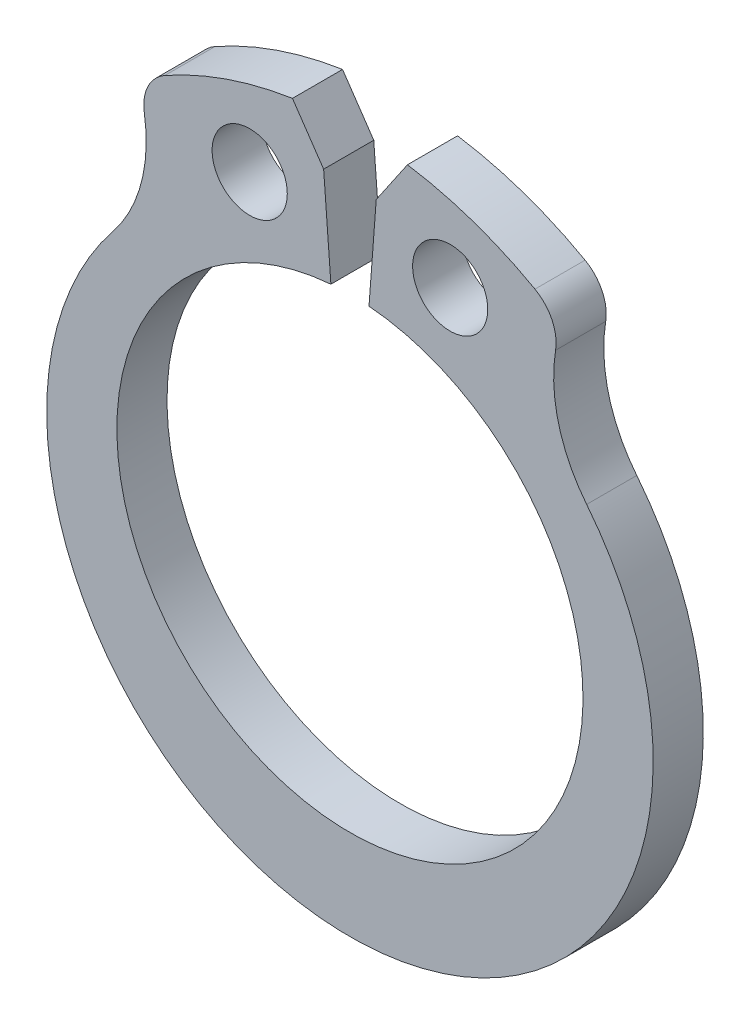
ISO-10303-21;
HEADER;
FILE_DESCRIPTION(('STEP AP214'),'2;1');
FILE_NAME('part.step','',(''),(''),'','','');
FILE_SCHEMA(('AUTOMOTIVE_DESIGN { 1 0 10303 214 1 1 1 1 }'));
ENDSEC;
DATA;
#1=APPLICATION_CONTEXT('core data for automotive mechanical design processes');
#2=APPLICATION_PROTOCOL_DEFINITION('international standard','automotive_design',2000,#1);
#3=PRODUCT_CONTEXT('',#1,'mechanical');
#4=PRODUCT('Part','Part','',(#3));
#5=PRODUCT_RELATED_PRODUCT_CATEGORY('part','',(#4));
#6=PRODUCT_DEFINITION_FORMATION('','',#4);
#7=PRODUCT_DEFINITION_CONTEXT('part definition',#1,'design');
#8=PRODUCT_DEFINITION('design','',#6,#7);
#9=PRODUCT_DEFINITION_SHAPE('','',#8);
#10=(LENGTH_UNIT() NAMED_UNIT(*) SI_UNIT(.MILLI.,.METRE.));
#11=(NAMED_UNIT(*) PLANE_ANGLE_UNIT() SI_UNIT($,.RADIAN.));
#12=(NAMED_UNIT(*) SI_UNIT($,.STERADIAN.) SOLID_ANGLE_UNIT());
#13=UNCERTAINTY_MEASURE_WITH_UNIT(LENGTH_MEASURE(1.E-05),#10,'distance_accuracy_value','');
#14=(GEOMETRIC_REPRESENTATION_CONTEXT(3) GLOBAL_UNCERTAINTY_ASSIGNED_CONTEXT((#13)) GLOBAL_UNIT_ASSIGNED_CONTEXT((#10,
#11,#12)) REPRESENTATION_CONTEXT('',''));
#15=CARTESIAN_POINT('',(0.,0.,0.));
#16=DIRECTION('',(0.,0.,1.));
#17=DIRECTION('',(1.,0.,0.));
#18=AXIS2_PLACEMENT_3D('',#15,#16,#17);
#19=CARTESIAN_POINT('',(2.38166766438672,0.368400837397194,1.));
#20=DIRECTION('',(0.,0.,1.));
#21=DIRECTION('',(1.,0.,0.));
#22=AXIS2_PLACEMENT_3D('',#19,#20,#21);
#23=PLANE('',#22);
#24=CARTESIAN_POINT('',(2.,5.76281181368957,1.));
#25=DIRECTION('',(0.,0.,-1.));
#26=DIRECTION('',(1.,0.,0.));
#27=AXIS2_PLACEMENT_3D('',#24,#25,#26);
#28=CIRCLE('',#27,0.75);
#29=CARTESIAN_POINT('',(1.25,5.76281181368957,1.));
#30=VERTEX_POINT('',#29);
#31=EDGE_CURVE('E46',#30,#30,#28,.T.);
#32=ORIENTED_EDGE('',*,*,#31,.T.);
#33=EDGE_LOOP('',(#32));
#34=FACE_BOUND('',#33,.T.);
#35=CARTESIAN_POINT('',(-2.,5.76281181368957,1.));
#36=DIRECTION('',(0.,0.,-1.));
#37=DIRECTION('',(-1.,0.,0.));
#38=AXIS2_PLACEMENT_3D('',#35,#36,#37);
#39=CIRCLE('',#38,0.75);
#40=CARTESIAN_POINT('',(-1.25,5.76281181368957,1.));
#41=VERTEX_POINT('',#40);
#42=EDGE_CURVE('E176',#41,#41,#39,.T.);
#43=ORIENTED_EDGE('',*,*,#42,.T.);
#44=EDGE_LOOP('',(#43));
#45=FACE_BOUND('',#44,.T.);
#46=CARTESIAN_POINT('',(0.,0.,1.));
#47=DIRECTION('',(0.,0.,-1.));
#48=DIRECTION('',(1.,0.,0.));
#49=AXIS2_PLACEMENT_3D('',#46,#47,#48);
#50=CIRCLE('',#49,4.65);
#51=CARTESIAN_POINT('',(0.38001478376536,4.63444589612607,1.));
#52=VERTEX_POINT('',#51);
#53=CARTESIAN_POINT('',(-0.38001478376536,4.63444589612607,1.));
#54=VERTEX_POINT('',#53);
#55=EDGE_CURVE('E142',#52,#54,#50,.T.);
#56=ORIENTED_EDGE('',*,*,#55,.T.);
#57=DIRECTION('',(-0.075268817204301,0.99716327908556,0.));
#58=VECTOR('',#57,1.);
#59=CARTESIAN_POINT('',(0.,-0.4,1.));
#60=LINE('',#59,#58);
#61=CARTESIAN_POINT('',(-0.524606441634727,6.55,1.));
#62=VERTEX_POINT('',#61);
#63=EDGE_CURVE('E126',#54,#62,#60,.T.);
#64=ORIENTED_EDGE('',*,*,#63,.T.);
#65=DIRECTION('',(-0.563766347354512,0.825934322806936,0.));
#66=VECTOR('',#65,1.);
#67=CARTESIAN_POINT('',(-0.524606441634727,6.55,1.));
#68=LINE('',#67,#66);
#69=CARTESIAN_POINT('',(-1.14733362509678,7.46231368629879,1.));
#70=VERTEX_POINT('',#69);
#71=EDGE_CURVE('E199',#62,#70,#68,.T.);
#72=ORIENTED_EDGE('',*,*,#71,.T.);
#73=CARTESIAN_POINT('',(0.,0.,1.));
#74=DIRECTION('',(0.,0.,-1.));
#75=DIRECTION('',(-1.,0.,0.));
#76=AXIS2_PLACEMENT_3D('',#73,#74,#75);
#77=CIRCLE('',#76,7.55);
#78=CARTESIAN_POINT('',(-3.69187189743232,6.58578635342428,1.));
#79=VERTEX_POINT('',#78);
#80=EDGE_CURVE('E197',#79,#70,#77,.T.);
#81=ORIENTED_EDGE('',*,*,#80,.F.);
#82=CARTESIAN_POINT('',(-3.28845543181885,5.8661474472554,1.));
#83=DIRECTION('',(0.,0.,-1.));
#84=DIRECTION('',(-1.,0.,0.));
#85=AXIS2_PLACEMENT_3D('',#82,#83,#84);
#86=CIRCLE('',#85,0.825);
#87=CARTESIAN_POINT('',(-4.10290526021445,5.73463137589376,1.));
#88=VERTEX_POINT('',#87);
#89=EDGE_CURVE('E196',#88,#79,#86,.T.);
#90=ORIENTED_EDGE('',*,*,#89,.F.);
#91=CARTESIAN_POINT('',(-7.06454099983476,5.2563911163969,1.));
#92=DIRECTION('',(0.,0.,-1.));
#93=DIRECTION('',(-1.,0.,0.));
#94=AXIS2_PLACEMENT_3D('',#91,#92,#93);
#95=CIRCLE('',#94,3.);
#96=CARTESIAN_POINT('',(-4.72270420430942,3.3813443374808,1.));
#97=VERTEX_POINT('',#96);
#98=EDGE_CURVE('E183',#88,#97,#95,.T.);
#99=ORIENTED_EDGE('',*,*,#98,.T.);
#100=CARTESIAN_POINT('',(0.,-0.4,1.));
#101=DIRECTION('',(0.,0.,-1.));
#102=DIRECTION('',(1.,0.,0.));
#103=AXIS2_PLACEMENT_3D('',#100,#101,#102);
#104=CIRCLE('',#103,6.05);
#105=CARTESIAN_POINT('',(4.72270420430942,3.3813443374808,1.));
#106=VERTEX_POINT('',#105);
#107=EDGE_CURVE('E11',#106,#97,#104,.T.);
#108=ORIENTED_EDGE('',*,*,#107,.F.);
#109=CARTESIAN_POINT('',(7.06454099983476,5.2563911163969,1.));
#110=DIRECTION('',(0.,0.,1.));
#111=DIRECTION('',(1.,0.,0.));
#112=AXIS2_PLACEMENT_3D('',#109,#110,#111);
#113=CIRCLE('',#112,3.);
#114=CARTESIAN_POINT('',(4.10290526021445,5.73463137589376,1.));
#115=VERTEX_POINT('',#114);
#116=EDGE_CURVE('E160',#115,#106,#113,.T.);
#117=ORIENTED_EDGE('',*,*,#116,.F.);
#118=CARTESIAN_POINT('',(3.28845543181885,5.8661474472554,1.));
#119=DIRECTION('',(0.,0.,-1.));
#120=DIRECTION('',(1.,0.,0.));
#121=AXIS2_PLACEMENT_3D('',#118,#119,#120);
#122=CIRCLE('',#121,0.825);
#123=CARTESIAN_POINT('',(3.69187189743232,6.58578635342428,1.));
#124=VERTEX_POINT('',#123);
#125=EDGE_CURVE('E155',#124,#115,#122,.T.);
#126=ORIENTED_EDGE('',*,*,#125,.F.);
#127=CARTESIAN_POINT('',(0.,0.,1.));
#128=DIRECTION('',(0.,0.,-1.));
#129=DIRECTION('',(1.,0.,0.));
#130=AXIS2_PLACEMENT_3D('',#127,#128,#129);
#131=CIRCLE('',#130,7.55);
#132=CARTESIAN_POINT('',(1.14733362509678,7.46231368629879,1.));
#133=VERTEX_POINT('',#132);
#134=EDGE_CURVE('E169',#133,#124,#131,.T.);
#135=ORIENTED_EDGE('',*,*,#134,.F.);
#136=DIRECTION('',(0.563766347354512,0.825934322806936,0.));
#137=VECTOR('',#136,1.);
#138=CARTESIAN_POINT('',(0.524606441634727,6.55,1.));
#139=LINE('',#138,#137);
#140=CARTESIAN_POINT('',(0.524606441634727,6.55,1.));
#141=VERTEX_POINT('',#140);
#142=EDGE_CURVE('E146',#141,#133,#139,.T.);
#143=ORIENTED_EDGE('',*,*,#142,.F.);
#144=DIRECTION('',(0.075268817204301,0.99716327908556,0.));
#145=VECTOR('',#144,1.);
#146=CARTESIAN_POINT('',(0.,-0.4,1.));
#147=LINE('',#146,#145);
#148=EDGE_CURVE('E148',#52,#141,#147,.T.);
#149=ORIENTED_EDGE('',*,*,#148,.F.);
#150=EDGE_LOOP('',(#56,#64,#72,#81,#90,#99,#108,#117,#126,#135,#143,#149));
#151=FACE_BOUND('',#150,.T.);
#152=ADVANCED_FACE('F17',(#34,#45,#151),#23,.T.);
#153=CARTESIAN_POINT('',(0.,-0.4,0.));
#154=DIRECTION('',(0.,0.,-1.));
#155=DIRECTION('',(1.,0.,0.));
#156=AXIS2_PLACEMENT_3D('',#153,#154,#155);
#157=CYLINDRICAL_SURFACE('',#156,6.05);
#158=ORIENTED_EDGE('',*,*,#107,.T.);
#159=DIRECTION('',(0.,0.,-1.));
#160=VECTOR('',#159,1.);
#161=CARTESIAN_POINT('',(-4.72270420430942,3.3813443374808,1.));
#162=LINE('',#161,#160);
#163=CARTESIAN_POINT('',(-4.72270420430942,3.3813443374808,0.));
#164=VERTEX_POINT('',#163);
#165=EDGE_CURVE('E185',#97,#164,#162,.T.);
#166=ORIENTED_EDGE('',*,*,#165,.T.);
#167=CARTESIAN_POINT('',(0.,-0.4,0.));
#168=DIRECTION('',(0.,0.,1.));
#169=DIRECTION('',(1.,0.,0.));
#170=AXIS2_PLACEMENT_3D('',#167,#168,#169);
#171=CIRCLE('',#170,6.05);
#172=CARTESIAN_POINT('',(4.72270420430942,3.3813443374808,0.));
#173=VERTEX_POINT('',#172);
#174=EDGE_CURVE('E21',#164,#173,#171,.T.);
#175=ORIENTED_EDGE('',*,*,#174,.T.);
#176=DIRECTION('',(0.,0.,1.));
#177=VECTOR('',#176,1.);
#178=CARTESIAN_POINT('',(4.72270420430942,3.3813443374808,0.));
#179=LINE('',#178,#177);
#180=EDGE_CURVE('E27',#173,#106,#179,.T.);
#181=ORIENTED_EDGE('',*,*,#180,.T.);
#182=EDGE_LOOP('',(#158,#166,#175,#181));
#183=FACE_BOUND('',#182,.T.);
#184=ADVANCED_FACE('F263',(#183),#157,.T.);
#185=CARTESIAN_POINT('',(7.06454099983476,5.2563911163969,0.));
#186=DIRECTION('',(0.,0.,-1.));
#187=DIRECTION('',(1.,0.,0.));
#188=AXIS2_PLACEMENT_3D('',#185,#186,#187);
#189=CYLINDRICAL_SURFACE('',#188,3.);
#190=ORIENTED_EDGE('',*,*,#116,.T.);
#191=ORIENTED_EDGE('',*,*,#180,.F.);
#192=CARTESIAN_POINT('',(7.06454099983476,5.2563911163969,0.));
#193=DIRECTION('',(0.,0.,1.));
#194=DIRECTION('',(1.,0.,0.));
#195=AXIS2_PLACEMENT_3D('',#192,#193,#194);
#196=CIRCLE('',#195,3.);
#197=CARTESIAN_POINT('',(4.10290526021445,5.73463137589376,0.));
#198=VERTEX_POINT('',#197);
#199=EDGE_CURVE('E226',#198,#173,#196,.T.);
#200=ORIENTED_EDGE('',*,*,#199,.F.);
#201=DIRECTION('',(0.,0.,1.));
#202=VECTOR('',#201,1.);
#203=CARTESIAN_POINT('',(4.10290526021445,5.73463137589376,0.));
#204=LINE('',#203,#202);
#205=EDGE_CURVE('E158',#198,#115,#204,.T.);
#206=ORIENTED_EDGE('',*,*,#205,.T.);
#207=EDGE_LOOP('',(#190,#191,#200,#206));
#208=FACE_BOUND('',#207,.T.);
#209=ADVANCED_FACE('F19',(#208),#189,.F.);
#210=CARTESIAN_POINT('',(3.28845543181885,5.8661474472554,0.));
#211=DIRECTION('',(0.,0.,-1.));
#212=DIRECTION('',(1.,0.,0.));
#213=AXIS2_PLACEMENT_3D('',#210,#211,#212);
#214=CYLINDRICAL_SURFACE('',#213,0.825);
#215=ORIENTED_EDGE('',*,*,#125,.T.);
#216=ORIENTED_EDGE('',*,*,#205,.F.);
#217=CARTESIAN_POINT('',(3.28845543181885,5.8661474472554,0.));
#218=DIRECTION('',(0.,0.,1.));
#219=DIRECTION('',(1.,0.,0.));
#220=AXIS2_PLACEMENT_3D('',#217,#218,#219);
#221=CIRCLE('',#220,0.825);
#222=CARTESIAN_POINT('',(3.69187189743232,6.58578635342428,0.));
#223=VERTEX_POINT('',#222);
#224=EDGE_CURVE('E208',#198,#223,#221,.T.);
#225=ORIENTED_EDGE('',*,*,#224,.T.);
#226=DIRECTION('',(0.,0.,1.));
#227=VECTOR('',#226,1.);
#228=CARTESIAN_POINT('',(3.69187189743232,6.58578635342428,0.));
#229=LINE('',#228,#227);
#230=EDGE_CURVE('E159',#223,#124,#229,.T.);
#231=ORIENTED_EDGE('',*,*,#230,.T.);
#232=EDGE_LOOP('',(#215,#216,#225,#231));
#233=FACE_BOUND('',#232,.T.);
#234=ADVANCED_FACE('F223',(#233),#214,.T.);
#235=CARTESIAN_POINT('',(0.,0.,0.));
#236=DIRECTION('',(0.,0.,-1.));
#237=DIRECTION('',(1.,0.,0.));
#238=AXIS2_PLACEMENT_3D('',#235,#236,#237);
#239=CYLINDRICAL_SURFACE('',#238,7.55);
#240=ORIENTED_EDGE('',*,*,#134,.T.);
#241=ORIENTED_EDGE('',*,*,#230,.F.);
#242=CARTESIAN_POINT('',(0.,0.,0.));
#243=DIRECTION('',(0.,0.,1.));
#244=DIRECTION('',(1.,0.,0.));
#245=AXIS2_PLACEMENT_3D('',#242,#243,#244);
#246=CIRCLE('',#245,7.55);
#247=CARTESIAN_POINT('',(1.14733362509678,7.46231368629879,0.));
#248=VERTEX_POINT('',#247);
#249=EDGE_CURVE('E151',#223,#248,#246,.T.);
#250=ORIENTED_EDGE('',*,*,#249,.T.);
#251=DIRECTION('',(0.,0.,1.));
#252=VECTOR('',#251,1.);
#253=CARTESIAN_POINT('',(1.14733362509678,7.46231368629879,0.));
#254=LINE('',#253,#252);
#255=EDGE_CURVE('E172',#248,#133,#254,.T.);
#256=ORIENTED_EDGE('',*,*,#255,.T.);
#257=EDGE_LOOP('',(#240,#241,#250,#256));
#258=FACE_BOUND('',#257,.T.);
#259=ADVANCED_FACE('F218',(#258),#239,.T.);
#260=CARTESIAN_POINT('',(0.835970033365753,7.0061568431494,0.));
#261=DIRECTION('',(-0.825934322806936,0.563766347354512,0.));
#262=DIRECTION('',(-0.563766347354512,-0.825934322806936,0.));
#263=AXIS2_PLACEMENT_3D('',#260,#261,#262);
#264=PLANE('',#263);
#265=ORIENTED_EDGE('',*,*,#142,.T.);
#266=ORIENTED_EDGE('',*,*,#255,.F.);
#267=DIRECTION('',(0.563766347354512,0.825934322806936,0.));
#268=VECTOR('',#267,1.);
#269=CARTESIAN_POINT('',(0.524606441634727,6.55,0.));
#270=LINE('',#269,#268);
#271=CARTESIAN_POINT('',(0.524606441634727,6.55,0.));
#272=VERTEX_POINT('',#271);
#273=EDGE_CURVE('E125',#272,#248,#270,.T.);
#274=ORIENTED_EDGE('',*,*,#273,.F.);
#275=DIRECTION('',(0.,0.,1.));
#276=VECTOR('',#275,1.);
#277=CARTESIAN_POINT('',(0.524606441634727,6.55,0.));
#278=LINE('',#277,#276);
#279=EDGE_CURVE('E121',#272,#141,#278,.T.);
#280=ORIENTED_EDGE('',*,*,#279,.T.);
#281=EDGE_LOOP('',(#265,#266,#274,#280));
#282=FACE_BOUND('',#281,.T.);
#283=ADVANCED_FACE('F216',(#282),#264,.T.);
#284=CARTESIAN_POINT('',(0.277399809065845,3.275,0.));
#285=DIRECTION('',(-0.99716327908556,0.075268817204301,0.));
#286=DIRECTION('',(-0.075268817204301,-0.99716327908556,0.));
#287=AXIS2_PLACEMENT_3D('',#284,#285,#286);
#288=PLANE('',#287);
#289=DIRECTION('',(0.,0.,1.));
#290=VECTOR('',#289,1.);
#291=CARTESIAN_POINT('',(0.38001478376536,4.63444589612607,0.5));
#292=LINE('',#291,#290);
#293=CARTESIAN_POINT('',(0.38001478376536,4.63444589612607,0.));
#294=VERTEX_POINT('',#293);
#295=EDGE_CURVE('E119',#294,#52,#292,.T.);
#296=ORIENTED_EDGE('',*,*,#295,.T.);
#297=ORIENTED_EDGE('',*,*,#148,.T.);
#298=ORIENTED_EDGE('',*,*,#279,.F.);
#299=DIRECTION('',(0.075268817204301,0.99716327908556,0.));
#300=VECTOR('',#299,1.);
#301=CARTESIAN_POINT('',(0.,-0.4,0.));
#302=LINE('',#301,#300);
#303=EDGE_CURVE('E114',#294,#272,#302,.T.);
#304=ORIENTED_EDGE('',*,*,#303,.F.);
#305=EDGE_LOOP('',(#296,#297,#298,#304));
#306=FACE_BOUND('',#305,.T.);
#307=ADVANCED_FACE('F116',(#306),#288,.T.);
#308=CARTESIAN_POINT('',(2.,5.76281181368957,0.5));
#309=DIRECTION('',(0.,0.,-1.));
#310=DIRECTION('',(1.,0.,0.));
#311=AXIS2_PLACEMENT_3D('',#308,#309,#310);
#312=CYLINDRICAL_SURFACE('',#311,0.75);
#313=ORIENTED_EDGE('',*,*,#31,.F.);
#314=EDGE_LOOP('',(#313));
#315=FACE_BOUND('',#314,.T.);
#316=CARTESIAN_POINT('',(2.,5.76281181368957,0.));
#317=DIRECTION('',(0.,0.,1.));
#318=DIRECTION('',(1.,0.,0.));
#319=AXIS2_PLACEMENT_3D('',#316,#317,#318);
#320=CIRCLE('',#319,0.75);
#321=CARTESIAN_POINT('',(1.25,5.76281181368957,0.));
#322=VERTEX_POINT('',#321);
#323=EDGE_CURVE('E163',#322,#322,#320,.T.);
#324=ORIENTED_EDGE('',*,*,#323,.F.);
#325=EDGE_LOOP('',(#324));
#326=FACE_BOUND('',#325,.T.);
#327=ADVANCED_FACE('F273',(#315,#326),#312,.F.);
#328=CARTESIAN_POINT('',(-7.06454099983476,5.2563911163969,1.));
#329=DIRECTION('',(0.,0.,1.));
#330=DIRECTION('',(-1.,0.,0.));
#331=AXIS2_PLACEMENT_3D('',#328,#329,#330);
#332=CYLINDRICAL_SURFACE('',#331,3.);
#333=CARTESIAN_POINT('',(-7.06454099983476,5.2563911163969,0.));
#334=DIRECTION('',(0.,0.,-1.));
#335=DIRECTION('',(-1.,0.,0.));
#336=AXIS2_PLACEMENT_3D('',#333,#334,#335);
#337=CIRCLE('',#336,3.);
#338=CARTESIAN_POINT('',(-4.10290526021445,5.73463137589376,0.));
#339=VERTEX_POINT('',#338);
#340=EDGE_CURVE('E182',#339,#164,#337,.T.);
#341=ORIENTED_EDGE('',*,*,#340,.T.);
#342=ORIENTED_EDGE('',*,*,#165,.F.);
#343=ORIENTED_EDGE('',*,*,#98,.F.);
#344=DIRECTION('',(0.,0.,-1.));
#345=VECTOR('',#344,1.);
#346=CARTESIAN_POINT('',(-4.10290526021445,5.73463137589376,1.));
#347=LINE('',#346,#345);
#348=EDGE_CURVE('E194',#88,#339,#347,.T.);
#349=ORIENTED_EDGE('',*,*,#348,.T.);
#350=EDGE_LOOP('',(#341,#342,#343,#349));
#351=FACE_BOUND('',#350,.T.);
#352=ADVANCED_FACE('F275',(#351),#332,.F.);
#353=CARTESIAN_POINT('',(-3.28845543181885,5.8661474472554,1.));
#354=DIRECTION('',(0.,0.,1.));
#355=DIRECTION('',(-1.,0.,0.));
#356=AXIS2_PLACEMENT_3D('',#353,#354,#355);
#357=CYLINDRICAL_SURFACE('',#356,0.825);
#358=CARTESIAN_POINT('',(-3.28845543181885,5.8661474472554,0.));
#359=DIRECTION('',(0.,0.,1.));
#360=DIRECTION('',(-1.,0.,0.));
#361=AXIS2_PLACEMENT_3D('',#358,#359,#360);
#362=CIRCLE('',#361,0.825);
#363=CARTESIAN_POINT('',(-3.69187189743232,6.58578635342428,0.));
#364=VERTEX_POINT('',#363);
#365=EDGE_CURVE('E178',#364,#339,#362,.T.);
#366=ORIENTED_EDGE('',*,*,#365,.T.);
#367=ORIENTED_EDGE('',*,*,#348,.F.);
#368=ORIENTED_EDGE('',*,*,#89,.T.);
#369=DIRECTION('',(0.,0.,-1.));
#370=VECTOR('',#369,1.);
#371=CARTESIAN_POINT('',(-3.69187189743232,6.58578635342428,1.));
#372=LINE('',#371,#370);
#373=EDGE_CURVE('E202',#79,#364,#372,.T.);
#374=ORIENTED_EDGE('',*,*,#373,.T.);
#375=EDGE_LOOP('',(#366,#367,#368,#374));
#376=FACE_BOUND('',#375,.T.);
#377=ADVANCED_FACE('F235',(#376),#357,.T.);
#378=CARTESIAN_POINT('',(0.,0.,1.));
#379=DIRECTION('',(0.,0.,1.));
#380=DIRECTION('',(-1.,0.,0.));
#381=AXIS2_PLACEMENT_3D('',#378,#379,#380);
#382=CYLINDRICAL_SURFACE('',#381,7.55);
#383=CARTESIAN_POINT('',(0.,0.,0.));
#384=DIRECTION('',(0.,0.,1.));
#385=DIRECTION('',(-1.,0.,0.));
#386=AXIS2_PLACEMENT_3D('',#383,#384,#385);
#387=CIRCLE('',#386,7.55);
#388=CARTESIAN_POINT('',(-1.14733362509678,7.46231368629879,0.));
#389=VERTEX_POINT('',#388);
#390=EDGE_CURVE('E181',#389,#364,#387,.T.);
#391=ORIENTED_EDGE('',*,*,#390,.T.);
#392=ORIENTED_EDGE('',*,*,#373,.F.);
#393=ORIENTED_EDGE('',*,*,#80,.T.);
#394=DIRECTION('',(0.,0.,-1.));
#395=VECTOR('',#394,1.);
#396=CARTESIAN_POINT('',(-1.14733362509678,7.46231368629879,1.));
#397=LINE('',#396,#395);
#398=EDGE_CURVE('E203',#70,#389,#397,.T.);
#399=ORIENTED_EDGE('',*,*,#398,.T.);
#400=EDGE_LOOP('',(#391,#392,#393,#399));
#401=FACE_BOUND('',#400,.T.);
#402=ADVANCED_FACE('F239',(#401),#382,.T.);
#403=CARTESIAN_POINT('',(-0.835970033365753,7.0061568431494,1.));
#404=DIRECTION('',(0.825934322806936,0.563766347354512,0.));
#405=DIRECTION('',(0.563766347354512,-0.825934322806936,0.));
#406=AXIS2_PLACEMENT_3D('',#403,#404,#405);
#407=PLANE('',#406);
#408=DIRECTION('',(-0.563766347354512,0.825934322806936,0.));
#409=VECTOR('',#408,1.);
#410=CARTESIAN_POINT('',(-0.524606441634727,6.55,0.));
#411=LINE('',#410,#409);
#412=CARTESIAN_POINT('',(-0.524606441634727,6.55,0.));
#413=VERTEX_POINT('',#412);
#414=EDGE_CURVE('E166',#413,#389,#411,.T.);
#415=ORIENTED_EDGE('',*,*,#414,.T.);
#416=ORIENTED_EDGE('',*,*,#398,.F.);
#417=ORIENTED_EDGE('',*,*,#71,.F.);
#418=DIRECTION('',(0.,0.,-1.));
#419=VECTOR('',#418,1.);
#420=CARTESIAN_POINT('',(-0.524606441634727,6.55,1.));
#421=LINE('',#420,#419);
#422=EDGE_CURVE('E154',#62,#413,#421,.T.);
#423=ORIENTED_EDGE('',*,*,#422,.T.);
#424=EDGE_LOOP('',(#415,#416,#417,#423));
#425=FACE_BOUND('',#424,.T.);
#426=ADVANCED_FACE('F249',(#425),#407,.T.);
#427=CARTESIAN_POINT('',(-2.,5.76281181368957,0.5));
#428=DIRECTION('',(0.,0.,1.));
#429=DIRECTION('',(-1.,0.,0.));
#430=AXIS2_PLACEMENT_3D('',#427,#428,#429);
#431=CYLINDRICAL_SURFACE('',#430,0.75);
#432=CARTESIAN_POINT('',(-2.,5.76281181368957,0.));
#433=DIRECTION('',(0.,0.,1.));
#434=DIRECTION('',(-1.,0.,0.));
#435=AXIS2_PLACEMENT_3D('',#432,#433,#434);
#436=CIRCLE('',#435,0.75);
#437=CARTESIAN_POINT('',(-1.25,5.76281181368957,0.));
#438=VERTEX_POINT('',#437);
#439=EDGE_CURVE('E165',#438,#438,#436,.T.);
#440=ORIENTED_EDGE('',*,*,#439,.F.);
#441=EDGE_LOOP('',(#440));
#442=FACE_BOUND('',#441,.T.);
#443=ORIENTED_EDGE('',*,*,#42,.F.);
#444=EDGE_LOOP('',(#443));
#445=FACE_BOUND('',#444,.T.);
#446=ADVANCED_FACE('F251',(#442,#445),#431,.F.);
#447=CARTESIAN_POINT('',(2.38166766438672,0.368400837397194,0.));
#448=DIRECTION('',(0.,0.,1.));
#449=DIRECTION('',(1.,0.,0.));
#450=AXIS2_PLACEMENT_3D('',#447,#448,#449);
#451=PLANE('',#450);
#452=ORIENTED_EDGE('',*,*,#439,.T.);
#453=EDGE_LOOP('',(#452));
#454=FACE_BOUND('',#453,.T.);
#455=ORIENTED_EDGE('',*,*,#323,.T.);
#456=EDGE_LOOP('',(#455));
#457=FACE_BOUND('',#456,.T.);
#458=CARTESIAN_POINT('',(0.,0.,0.));
#459=DIRECTION('',(0.,0.,1.));
#460=DIRECTION('',(1.,0.,0.));
#461=AXIS2_PLACEMENT_3D('',#458,#459,#460);
#462=CIRCLE('',#461,4.65);
#463=CARTESIAN_POINT('',(-0.38001478376536,4.63444589612607,0.));
#464=VERTEX_POINT('',#463);
#465=EDGE_CURVE('E129',#464,#294,#462,.T.);
#466=ORIENTED_EDGE('',*,*,#465,.T.);
#467=ORIENTED_EDGE('',*,*,#303,.T.);
#468=ORIENTED_EDGE('',*,*,#273,.T.);
#469=ORIENTED_EDGE('',*,*,#249,.F.);
#470=ORIENTED_EDGE('',*,*,#224,.F.);
#471=ORIENTED_EDGE('',*,*,#199,.T.);
#472=ORIENTED_EDGE('',*,*,#174,.F.);
#473=ORIENTED_EDGE('',*,*,#340,.F.);
#474=ORIENTED_EDGE('',*,*,#365,.F.);
#475=ORIENTED_EDGE('',*,*,#390,.F.);
#476=ORIENTED_EDGE('',*,*,#414,.F.);
#477=DIRECTION('',(-0.075268817204301,0.99716327908556,0.));
#478=VECTOR('',#477,1.);
#479=CARTESIAN_POINT('',(0.,-0.4,0.));
#480=LINE('',#479,#478);
#481=EDGE_CURVE('E133',#464,#413,#480,.T.);
#482=ORIENTED_EDGE('',*,*,#481,.F.);
#483=EDGE_LOOP('',(#466,#467,#468,#469,#470,#471,#472,#473,#474,#475,#476,#482));
#484=FACE_BOUND('',#483,.T.);
#485=ADVANCED_FACE('F130',(#454,#457,#484),#451,.F.);
#486=CARTESIAN_POINT('',(-0.277399809065845,3.275,1.));
#487=DIRECTION('',(0.99716327908556,0.075268817204301,0.));
#488=DIRECTION('',(0.075268817204301,-0.99716327908556,0.));
#489=AXIS2_PLACEMENT_3D('',#486,#487,#488);
#490=PLANE('',#489);
#491=DIRECTION('',(0.,0.,-1.));
#492=VECTOR('',#491,1.);
#493=CARTESIAN_POINT('',(-0.38001478376536,4.63444589612607,0.5));
#494=LINE('',#493,#492);
#495=EDGE_CURVE('E137',#54,#464,#494,.T.);
#496=ORIENTED_EDGE('',*,*,#495,.T.);
#497=ORIENTED_EDGE('',*,*,#481,.T.);
#498=ORIENTED_EDGE('',*,*,#422,.F.);
#499=ORIENTED_EDGE('',*,*,#63,.F.);
#500=EDGE_LOOP('',(#496,#497,#498,#499));
#501=FACE_BOUND('',#500,.T.);
#502=ADVANCED_FACE('F247',(#501),#490,.T.);
#503=CARTESIAN_POINT('',(0.,0.,0.5));
#504=DIRECTION('',(0.,0.,-1.));
#505=DIRECTION('',(1.,0.,0.));
#506=AXIS2_PLACEMENT_3D('',#503,#504,#505);
#507=CYLINDRICAL_SURFACE('',#506,4.65);
#508=ORIENTED_EDGE('',*,*,#295,.F.);
#509=ORIENTED_EDGE('',*,*,#465,.F.);
#510=ORIENTED_EDGE('',*,*,#495,.F.);
#511=ORIENTED_EDGE('',*,*,#55,.F.);
#512=EDGE_LOOP('',(#508,#509,#510,#511));
#513=FACE_BOUND('',#512,.T.);
#514=ADVANCED_FACE('F140',(#513),#507,.F.);
#515=CLOSED_SHELL('',(#152,#184,#209,#234,#259,#283,#307,#327,#352,#377,#402,#426,#446,#485,
#502,#514));
#516=MANIFOLD_SOLID_BREP('B1',#515);
#517=ADVANCED_BREP_SHAPE_REPRESENTATION('',(#18,#516),#14);
#518=SHAPE_DEFINITION_REPRESENTATION(#9,#517);
ENDSEC;
END-ISO-10303-21;
